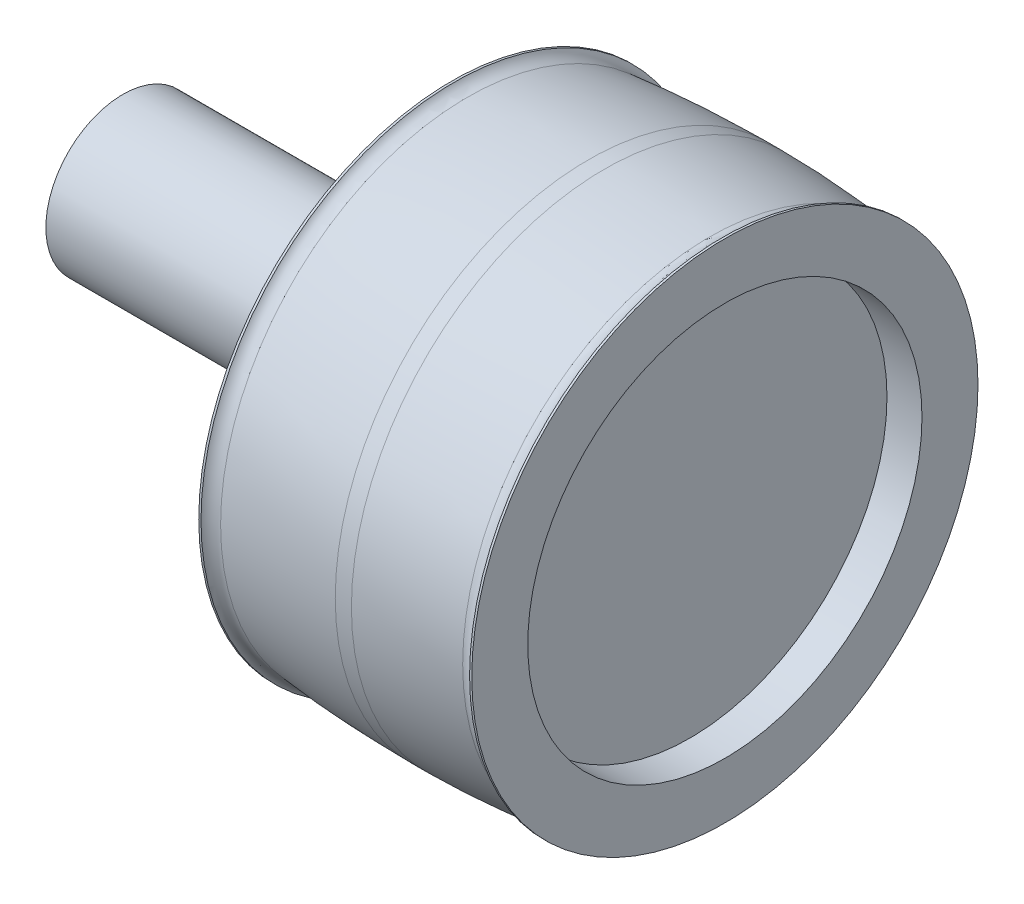
ISO-10303-21;
HEADER;
FILE_DESCRIPTION(('STEP AP214'),'2;1');
FILE_NAME('part.step','',(''),(''),'','','');
FILE_SCHEMA(('AUTOMOTIVE_DESIGN { 1 0 10303 214 1 1 1 1 }'));
ENDSEC;
DATA;
#1=APPLICATION_CONTEXT('core data for automotive mechanical design processes');
#2=APPLICATION_PROTOCOL_DEFINITION('international standard','automotive_design',2000,#1);
#3=PRODUCT_CONTEXT('',#1,'mechanical');
#4=PRODUCT('Part','Part','',(#3));
#5=PRODUCT_RELATED_PRODUCT_CATEGORY('part','',(#4));
#6=PRODUCT_DEFINITION_FORMATION('','',#4);
#7=PRODUCT_DEFINITION_CONTEXT('part definition',#1,'design');
#8=PRODUCT_DEFINITION('design','',#6,#7);
#9=PRODUCT_DEFINITION_SHAPE('','',#8);
#10=(LENGTH_UNIT() NAMED_UNIT(*) SI_UNIT(.MILLI.,.METRE.));
#11=(NAMED_UNIT(*) PLANE_ANGLE_UNIT() SI_UNIT($,.RADIAN.));
#12=(NAMED_UNIT(*) SI_UNIT($,.STERADIAN.) SOLID_ANGLE_UNIT());
#13=UNCERTAINTY_MEASURE_WITH_UNIT(LENGTH_MEASURE(1.E-05),#10,'distance_accuracy_value','');
#14=(GEOMETRIC_REPRESENTATION_CONTEXT(3) GLOBAL_UNCERTAINTY_ASSIGNED_CONTEXT((#13)) GLOBAL_UNIT_ASSIGNED_CONTEXT((#10,
#11,#12)) REPRESENTATION_CONTEXT('',''));
#15=CARTESIAN_POINT('',(0.,0.,0.));
#16=DIRECTION('',(0.,0.,1.));
#17=DIRECTION('',(1.,0.,0.));
#18=AXIS2_PLACEMENT_3D('',#15,#16,#17);
#19=CARTESIAN_POINT('',(-7.25,-30.6972760772363,-2.44967934269345E-11));
#20=DIRECTION('',(-1.,0.,0.));
#21=DIRECTION('',(0.,0.,1.));
#22=AXIS2_PLACEMENT_3D('',#19,#20,#21);
#23=PLANE('',#22);
#24=CARTESIAN_POINT('',(-7.25,-30.6972760772363,-2.44967934269345E-11));
#25=DIRECTION('',(-1.,0.,0.));
#26=DIRECTION('',(0.,0.,1.));
#27=AXIS2_PLACEMENT_3D('',#24,#25,#26);
#28=CIRCLE('',#27,14.08);
#29=CARTESIAN_POINT('',(-7.25,-30.6972760772363,14.0799999999755));
#30=VERTEX_POINT('',#29);
#31=EDGE_CURVE('E136',#30,#30,#28,.T.);
#32=ORIENTED_EDGE('',*,*,#31,.T.);
#33=EDGE_LOOP('',(#32));
#34=FACE_BOUND('',#33,.T.);
#35=CARTESIAN_POINT('',(-7.25,-30.6972760772363,-2.44967934269345E-11));
#36=DIRECTION('',(-1.,0.,0.));
#37=DIRECTION('',(0.,0.,1.));
#38=AXIS2_PLACEMENT_3D('',#35,#36,#37);
#39=CIRCLE('',#38,5.5);
#40=CARTESIAN_POINT('',(-7.25,-30.6972760772363,-5.5000000000245));
#41=VERTEX_POINT('',#40);
#42=EDGE_CURVE('E144',#41,#41,#39,.T.);
#43=ORIENTED_EDGE('',*,*,#42,.F.);
#44=EDGE_LOOP('',(#43));
#45=FACE_BOUND('',#44,.T.);
#46=ADVANCED_FACE('F31',(#34,#45),#23,.T.);
#47=CARTESIAN_POINT('',(-9.75,-30.6972760772363,-2.44967934269345E-11));
#48=DIRECTION('',(1.,0.,0.));
#49=DIRECTION('',(0.,0.,-1.));
#50=AXIS2_PLACEMENT_3D('',#47,#48,#49);
#51=CYLINDRICAL_SURFACE('',#50,18.08);
#52=CARTESIAN_POINT('',(-9.75,-30.6972760772363,-2.44967934269345E-11));
#53=DIRECTION('',(1.,0.,0.));
#54=DIRECTION('',(0.,0.,-1.));
#55=AXIS2_PLACEMENT_3D('',#52,#53,#54);
#56=CIRCLE('',#55,18.08);
#57=CARTESIAN_POINT('',(-9.75,-30.6972760772363,-18.0800000000245));
#58=VERTEX_POINT('',#57);
#59=EDGE_CURVE('E10',#58,#58,#56,.T.);
#60=ORIENTED_EDGE('',*,*,#59,.T.);
#61=EDGE_LOOP('',(#60));
#62=FACE_BOUND('',#61,.T.);
#63=CARTESIAN_POINT('',(-9.58956781339732,-30.6972760772363,-2.44967934269345E-11));
#64=DIRECTION('',(1.,0.,0.));
#65=DIRECTION('',(0.,0.,-1.));
#66=AXIS2_PLACEMENT_3D('',#63,#64,#65);
#67=CIRCLE('',#66,18.08);
#68=CARTESIAN_POINT('',(-9.58956781339732,-30.6972760772363,-18.0800000000245));
#69=VERTEX_POINT('',#68);
#70=EDGE_CURVE('E35',#69,#69,#67,.F.);
#71=ORIENTED_EDGE('',*,*,#70,.T.);
#72=EDGE_LOOP('',(#71));
#73=FACE_BOUND('',#72,.T.);
#74=ADVANCED_FACE('F33',(#62,#73),#51,.T.);
#75=CARTESIAN_POINT('',(-9.75,-30.6972760772363,-2.44967934269345E-11));
#76=DIRECTION('',(1.,0.,0.));
#77=DIRECTION('',(0.,0.,-1.));
#78=AXIS2_PLACEMENT_3D('',#75,#76,#77);
#79=PLANE('',#78);
#80=CARTESIAN_POINT('',(-9.75,-30.6972760772363,-2.44967934269345E-11));
#81=DIRECTION('',(-1.,0.,0.));
#82=DIRECTION('',(0.,0.,1.));
#83=AXIS2_PLACEMENT_3D('',#80,#81,#82);
#84=CIRCLE('',#83,14.08);
#85=CARTESIAN_POINT('',(-9.75,-30.6972760772363,14.0799999999755));
#86=VERTEX_POINT('',#85);
#87=EDGE_CURVE('E137',#86,#86,#84,.T.);
#88=ORIENTED_EDGE('',*,*,#87,.F.);
#89=EDGE_LOOP('',(#88));
#90=FACE_BOUND('',#89,.T.);
#91=ORIENTED_EDGE('',*,*,#59,.F.);
#92=EDGE_LOOP('',(#91));
#93=FACE_BOUND('',#92,.T.);
#94=ADVANCED_FACE('F96',(#90,#93),#79,.F.);
#95=CARTESIAN_POINT('',(-8.63949791795001,-13.0678970695124,0.));
#96=CARTESIAN_POINT('',(-5.9626586622051,-12.7702781079459,0.));
#97=CARTESIAN_POINT('',(1.01895096601607,-12.4807579289736,0.));
#98=CARTESIAN_POINT('',(5.40115706098064,-12.7298575540861,0.));
#99=CARTESIAN_POINT('',(8.64421147663579,-13.0748714856482,0.));
#100=B_SPLINE_CURVE_WITH_KNOTS('',3,(#95,#96,#97,#98,#99),.UNSPECIFIED.,.F.,.F.,(4,1,4),
(0.0573405456291309,0.473274059311417,0.946548118622834),.UNSPECIFIED.);
#101=CARTESIAN_POINT('',(9.75,-30.6972760772363,-2.44967934269345E-11));
#102=DIRECTION('',(-1.,0.,0.));
#103=AXIS1_PLACEMENT('',#101,#102);
#104=SURFACE_OF_REVOLUTION('',#100,#103);
#105=CARTESIAN_POINT('',(-1.64798730217797E-13,-30.6972760772363,-2.44967934269345E-11));
#106=DIRECTION('',(-1.,0.,0.));
#107=DIRECTION('',(0.,0.,1.));
#108=AXIS2_PLACEMENT_3D('',#105,#106,#107);
#109=CIRCLE('',#108,18.08);
#110=CARTESIAN_POINT('',(-1.64798730217797E-13,-30.6972760772363,18.0799999999755));
#111=VERTEX_POINT('',#110);
#112=EDGE_CURVE('E53',#111,#111,#109,.F.);
#113=ORIENTED_EDGE('',*,*,#112,.F.);
#114=EDGE_LOOP('',(#113));
#115=FACE_BOUND('',#114,.T.);
#116=CARTESIAN_POINT('',(-8.63949791795001,-30.6972760772363,-2.44967934269345E-11));
#117=DIRECTION('',(-1.,0.,0.));
#118=DIRECTION('',(0.,0.,1.));
#119=AXIS2_PLACEMENT_3D('',#116,#117,#118);
#120=CIRCLE('',#119,17.6293790077238);
#121=CARTESIAN_POINT('',(-8.63949791795001,-30.6972760772363,17.6293790076993));
#122=VERTEX_POINT('',#121);
#123=EDGE_CURVE('E51',#122,#122,#120,.T.);
#124=ORIENTED_EDGE('',*,*,#123,.F.);
#125=EDGE_LOOP('',(#124));
#126=FACE_BOUND('',#125,.T.);
#127=ADVANCED_FACE('F65',(#115,#126),#104,.F.);
#128=CARTESIAN_POINT('',(-8.7500000000016,-30.6972760772363,-2.44967934269345E-11));
#129=DIRECTION('',(-1.,0.,0.));
#130=DIRECTION('',(0.,0.,1.));
#131=AXIS2_PLACEMENT_3D('',#128,#129,#130);
#132=TOROIDAL_SURFACE('',#131,18.6232549003092,0.999999999999997);
#133=ORIENTED_EDGE('',*,*,#70,.F.);
#134=EDGE_LOOP('',(#133));
#135=FACE_BOUND('',#134,.T.);
#136=ORIENTED_EDGE('',*,*,#123,.T.);
#137=EDGE_LOOP('',(#136));
#138=FACE_BOUND('',#137,.T.);
#139=ADVANCED_FACE('F61',(#135,#138),#132,.F.);
#140=CARTESIAN_POINT('',(1.15355220921084,-30.6972760772363,-2.44967934269345E-11));
#141=DIRECTION('',(-1.,0.,0.));
#142=DIRECTION('',(0.,0.,1.));
#143=AXIS2_PLACEMENT_3D('',#140,#141,#142);
#144=CIRCLE('',#143,18.08);
#145=CARTESIAN_POINT('',(1.15355220921084,-30.6972760772363,18.0799999999755));
#146=VERTEX_POINT('',#145);
#147=EDGE_CURVE('E50',#146,#146,#144,.T.);
#148=ORIENTED_EDGE('',*,*,#147,.T.);
#149=EDGE_LOOP('',(#148));
#150=FACE_BOUND('',#149,.T.);
#151=ORIENTED_EDGE('',*,*,#112,.T.);
#152=EDGE_LOOP('',(#151));
#153=FACE_BOUND('',#152,.T.);
#154=ADVANCED_FACE('F64',(#150,#153),#51,.T.);
#155=CARTESIAN_POINT('',(8.74999999999871,-30.6972760772363,-2.44967934269345E-11));
#156=DIRECTION('',(-1.,0.,0.));
#157=DIRECTION('',(0.,0.,1.));
#158=AXIS2_PLACEMENT_3D('',#155,#156,#157);
#159=TOROIDAL_SURFACE('',#158,18.6167932421291,1.);
#160=CARTESIAN_POINT('',(9.59371382304805,-30.6972760772363,-2.44967934269345E-11));
#161=DIRECTION('',(-1.,0.,0.));
#162=DIRECTION('',(0.,0.,1.));
#163=AXIS2_PLACEMENT_3D('',#160,#161,#162);
#164=CIRCLE('',#163,18.08);
#165=CARTESIAN_POINT('',(9.59371382304805,-30.6972760772363,18.0799999999755));
#166=VERTEX_POINT('',#165);
#167=EDGE_CURVE('E47',#166,#166,#164,.F.);
#168=ORIENTED_EDGE('',*,*,#167,.F.);
#169=EDGE_LOOP('',(#168));
#170=FACE_BOUND('',#169,.T.);
#171=CARTESIAN_POINT('',(8.64421147663579,-30.6972760772363,-2.44967934269345E-11));
#172=DIRECTION('',(-1.,0.,0.));
#173=DIRECTION('',(0.,0.,1.));
#174=AXIS2_PLACEMENT_3D('',#171,#172,#173);
#175=CIRCLE('',#174,17.6224045915881);
#176=CARTESIAN_POINT('',(8.64421147663579,-30.6972760772363,17.6224045915636));
#177=VERTEX_POINT('',#176);
#178=EDGE_CURVE('E70',#177,#177,#175,.T.);
#179=ORIENTED_EDGE('',*,*,#178,.F.);
#180=EDGE_LOOP('',(#179));
#181=FACE_BOUND('',#180,.T.);
#182=ADVANCED_FACE('F89',(#170,#181),#159,.F.);
#183=ORIENTED_EDGE('',*,*,#147,.F.);
#184=EDGE_LOOP('',(#183));
#185=FACE_BOUND('',#184,.T.);
#186=ORIENTED_EDGE('',*,*,#178,.T.);
#187=EDGE_LOOP('',(#186));
#188=FACE_BOUND('',#187,.T.);
#189=ADVANCED_FACE('F85',(#185,#188),#104,.F.);
#190=CARTESIAN_POINT('',(9.75,-30.6972760772363,-2.44967934269345E-11));
#191=DIRECTION('',(1.,0.,0.));
#192=DIRECTION('',(0.,0.,-1.));
#193=AXIS2_PLACEMENT_3D('',#190,#191,#192);
#194=PLANE('',#193);
#195=CARTESIAN_POINT('',(9.75,-30.6972760772363,-2.44967934269345E-11));
#196=DIRECTION('',(1.,0.,0.));
#197=DIRECTION('',(0.,0.,-1.));
#198=AXIS2_PLACEMENT_3D('',#195,#196,#197);
#199=CIRCLE('',#198,14.08);
#200=CARTESIAN_POINT('',(9.75,-30.6972760772363,-14.0800000000245));
#201=VERTEX_POINT('',#200);
#202=EDGE_CURVE('E79',#201,#201,#199,.T.);
#203=ORIENTED_EDGE('',*,*,#202,.F.);
#204=EDGE_LOOP('',(#203));
#205=FACE_BOUND('',#204,.T.);
#206=CARTESIAN_POINT('',(9.75,-30.6972760772363,-2.44967934269345E-11));
#207=DIRECTION('',(1.,0.,0.));
#208=DIRECTION('',(0.,0.,-1.));
#209=AXIS2_PLACEMENT_3D('',#206,#207,#208);
#210=CIRCLE('',#209,18.08);
#211=CARTESIAN_POINT('',(9.75,-30.6972760772363,-18.0800000000245));
#212=VERTEX_POINT('',#211);
#213=EDGE_CURVE('E39',#212,#212,#210,.T.);
#214=ORIENTED_EDGE('',*,*,#213,.T.);
#215=EDGE_LOOP('',(#214));
#216=FACE_BOUND('',#215,.T.);
#217=ADVANCED_FACE('F88',(#205,#216),#194,.T.);
#218=ORIENTED_EDGE('',*,*,#213,.F.);
#219=EDGE_LOOP('',(#218));
#220=FACE_BOUND('',#219,.T.);
#221=ORIENTED_EDGE('',*,*,#167,.T.);
#222=EDGE_LOOP('',(#221));
#223=FACE_BOUND('',#222,.T.);
#224=ADVANCED_FACE('F94',(#220,#223),#51,.T.);
#225=CARTESIAN_POINT('',(7.25,-30.6972760772363,-2.44967934269345E-11));
#226=DIRECTION('',(1.,0.,0.));
#227=DIRECTION('',(0.,0.,-1.));
#228=AXIS2_PLACEMENT_3D('',#225,#226,#227);
#229=CYLINDRICAL_SURFACE('',#228,14.08);
#230=CARTESIAN_POINT('',(7.25,-30.6972760772363,-2.44967934269345E-11));
#231=DIRECTION('',(1.,0.,0.));
#232=DIRECTION('',(0.,0.,-1.));
#233=AXIS2_PLACEMENT_3D('',#230,#231,#232);
#234=CIRCLE('',#233,14.08);
#235=CARTESIAN_POINT('',(7.25,-30.6972760772363,-14.0800000000245));
#236=VERTEX_POINT('',#235);
#237=EDGE_CURVE('E72',#236,#236,#234,.T.);
#238=ORIENTED_EDGE('',*,*,#237,.F.);
#239=EDGE_LOOP('',(#238));
#240=FACE_BOUND('',#239,.T.);
#241=ORIENTED_EDGE('',*,*,#202,.T.);
#242=EDGE_LOOP('',(#241));
#243=FACE_BOUND('',#242,.T.);
#244=ADVANCED_FACE('F123',(#240,#243),#229,.F.);
#245=CARTESIAN_POINT('',(7.25,-30.6972760772363,-2.44967934269345E-11));
#246=DIRECTION('',(1.,0.,0.));
#247=DIRECTION('',(0.,0.,-1.));
#248=AXIS2_PLACEMENT_3D('',#245,#246,#247);
#249=PLANE('',#248);
#250=ORIENTED_EDGE('',*,*,#237,.T.);
#251=EDGE_LOOP('',(#250));
#252=FACE_BOUND('',#251,.T.);
#253=ADVANCED_FACE('F120',(#252),#249,.T.);
#254=CARTESIAN_POINT('',(-7.25,-30.6972760772363,-2.44967934269345E-11));
#255=DIRECTION('',(-1.,0.,0.));
#256=DIRECTION('',(0.,0.,1.));
#257=AXIS2_PLACEMENT_3D('',#254,#255,#256);
#258=CYLINDRICAL_SURFACE('',#257,14.08);
#259=ORIENTED_EDGE('',*,*,#31,.F.);
#260=EDGE_LOOP('',(#259));
#261=FACE_BOUND('',#260,.T.);
#262=ORIENTED_EDGE('',*,*,#87,.T.);
#263=EDGE_LOOP('',(#262));
#264=FACE_BOUND('',#263,.T.);
#265=ADVANCED_FACE('F117',(#261,#264),#258,.F.);
#266=CARTESIAN_POINT('',(-33.25,-30.6972760772363,-2.44967934269345E-11));
#267=DIRECTION('',(1.,0.,0.));
#268=DIRECTION('',(0.,0.,-1.));
#269=AXIS2_PLACEMENT_3D('',#266,#267,#268);
#270=CYLINDRICAL_SURFACE('',#269,5.5);
#271=CARTESIAN_POINT('',(-33.25,-30.6972760772363,-2.44967934269345E-11));
#272=DIRECTION('',(-1.,0.,0.));
#273=DIRECTION('',(0.,0.,1.));
#274=AXIS2_PLACEMENT_3D('',#271,#272,#273);
#275=CIRCLE('',#274,5.5);
#276=CARTESIAN_POINT('',(-33.25,-30.6972760772363,-5.5000000000245));
#277=VERTEX_POINT('',#276);
#278=EDGE_CURVE('E141',#277,#277,#275,.T.);
#279=CARTESIAN_POINT('',(-33.25,-30.6972760772363,-5.5000000000245));
#280=CARTESIAN_POINT('',(-32.9791666666667,-30.6972760772363,-5.5000000000245));
#281=CARTESIAN_POINT('',(-32.7083333333333,-30.6972760772363,-5.5000000000245));
#282=CARTESIAN_POINT('',(-32.1666666666667,-30.6972760772363,-5.5000000000245));
#283=CARTESIAN_POINT('',(-31.8958333333333,-30.6972760772363,-5.5000000000245));
#284=CARTESIAN_POINT('',(-31.3541666666667,-30.6972760772363,-5.5000000000245));
#285=CARTESIAN_POINT('',(-31.0833333333333,-30.6972760772363,-5.5000000000245));
#286=CARTESIAN_POINT('',(-30.5416666666667,-30.6972760772363,-5.5000000000245));
#287=CARTESIAN_POINT('',(-30.2708333333333,-30.6972760772363,-5.5000000000245));
#288=CARTESIAN_POINT('',(-29.7291666666667,-30.6972760772363,-5.5000000000245));
#289=CARTESIAN_POINT('',(-29.4583333333333,-30.6972760772363,-5.5000000000245));
#290=CARTESIAN_POINT('',(-28.9166666666667,-30.6972760772363,-5.5000000000245));
#291=CARTESIAN_POINT('',(-28.6458333333333,-30.6972760772363,-5.5000000000245));
#292=CARTESIAN_POINT('',(-28.1041666666667,-30.6972760772363,-5.5000000000245));
#293=CARTESIAN_POINT('',(-27.8333333333333,-30.6972760772363,-5.5000000000245));
#294=CARTESIAN_POINT('',(-27.2916666666667,-30.6972760772363,-5.5000000000245));
#295=CARTESIAN_POINT('',(-27.0208333333333,-30.6972760772363,-5.5000000000245));
#296=CARTESIAN_POINT('',(-26.4791666666667,-30.6972760772363,-5.5000000000245));
#297=CARTESIAN_POINT('',(-26.2083333333333,-30.6972760772363,-5.5000000000245));
#298=CARTESIAN_POINT('',(-25.6666666666667,-30.6972760772363,-5.5000000000245));
#299=CARTESIAN_POINT('',(-25.3958333333333,-30.6972760772363,-5.5000000000245));
#300=CARTESIAN_POINT('',(-24.8541666666667,-30.6972760772363,-5.5000000000245));
#301=CARTESIAN_POINT('',(-24.5833333333333,-30.6972760772363,-5.5000000000245));
#302=CARTESIAN_POINT('',(-24.0416666666667,-30.6972760772363,-5.5000000000245));
#303=CARTESIAN_POINT('',(-23.7708333333333,-30.6972760772363,-5.5000000000245));
#304=CARTESIAN_POINT('',(-23.2291666666667,-30.6972760772363,-5.5000000000245));
#305=CARTESIAN_POINT('',(-22.9583333333333,-30.6972760772363,-5.5000000000245));
#306=CARTESIAN_POINT('',(-22.4166666666667,-30.6972760772363,-5.5000000000245));
#307=CARTESIAN_POINT('',(-22.1458333333333,-30.6972760772363,-5.5000000000245));
#308=CARTESIAN_POINT('',(-21.6041666666667,-30.6972760772363,-5.5000000000245));
#309=CARTESIAN_POINT('',(-21.3333333333333,-30.6972760772363,-5.5000000000245));
#310=CARTESIAN_POINT('',(-20.7916666666667,-30.6972760772363,-5.5000000000245));
#311=CARTESIAN_POINT('',(-20.5208333333333,-30.6972760772363,-5.5000000000245));
#312=CARTESIAN_POINT('',(-19.9791666666667,-30.6972760772363,-5.5000000000245));
#313=CARTESIAN_POINT('',(-19.7083333333333,-30.6972760772363,-5.5000000000245));
#314=CARTESIAN_POINT('',(-19.1666666666667,-30.6972760772363,-5.5000000000245));
#315=CARTESIAN_POINT('',(-18.8958333333333,-30.6972760772363,-5.5000000000245));
#316=CARTESIAN_POINT('',(-18.3541666666667,-30.6972760772363,-5.5000000000245));
#317=CARTESIAN_POINT('',(-18.0833333333333,-30.6972760772363,-5.5000000000245));
#318=CARTESIAN_POINT('',(-17.5416666666667,-30.6972760772363,-5.5000000000245));
#319=CARTESIAN_POINT('',(-17.2708333333333,-30.6972760772363,-5.5000000000245));
#320=CARTESIAN_POINT('',(-16.7291666666667,-30.6972760772363,-5.5000000000245));
#321=CARTESIAN_POINT('',(-16.4583333333333,-30.6972760772363,-5.5000000000245));
#322=CARTESIAN_POINT('',(-15.9166666666667,-30.6972760772363,-5.5000000000245));
#323=CARTESIAN_POINT('',(-15.6458333333333,-30.6972760772363,-5.5000000000245));
#324=CARTESIAN_POINT('',(-15.1041666666667,-30.6972760772363,-5.5000000000245));
#325=CARTESIAN_POINT('',(-14.8333333333333,-30.6972760772363,-5.5000000000245));
#326=CARTESIAN_POINT('',(-14.2916666666667,-30.6972760772363,-5.5000000000245));
#327=CARTESIAN_POINT('',(-14.0208333333333,-30.6972760772363,-5.5000000000245));
#328=CARTESIAN_POINT('',(-13.4791666666667,-30.6972760772363,-5.5000000000245));
#329=CARTESIAN_POINT('',(-13.2083333333333,-30.6972760772363,-5.5000000000245));
#330=CARTESIAN_POINT('',(-12.6666666666667,-30.6972760772363,-5.5000000000245));
#331=CARTESIAN_POINT('',(-12.3958333333333,-30.6972760772363,-5.5000000000245));
#332=CARTESIAN_POINT('',(-11.8541666666667,-30.6972760772363,-5.5000000000245));
#333=CARTESIAN_POINT('',(-11.5833333333333,-30.6972760772363,-5.5000000000245));
#334=CARTESIAN_POINT('',(-11.0416666666667,-30.6972760772363,-5.5000000000245));
#335=CARTESIAN_POINT('',(-10.7708333333333,-30.6972760772363,-5.5000000000245));
#336=CARTESIAN_POINT('',(-10.2291666666667,-30.6972760772363,-5.5000000000245));
#337=CARTESIAN_POINT('',(-9.95833333333333,-30.6972760772363,-5.5000000000245));
#338=CARTESIAN_POINT('',(-9.41666666666667,-30.6972760772363,-5.5000000000245));
#339=CARTESIAN_POINT('',(-9.14583333333333,-30.6972760772363,-5.5000000000245));
#340=CARTESIAN_POINT('',(-8.60416666666666,-30.6972760772363,-5.5000000000245));
#341=CARTESIAN_POINT('',(-8.33333333333333,-30.6972760772363,-5.5000000000245));
#342=CARTESIAN_POINT('',(-7.79166666666666,-30.6972760772363,-5.5000000000245));
#343=CARTESIAN_POINT('',(-7.52083333333333,-30.6972760772363,-5.5000000000245));
#344=CARTESIAN_POINT('',(-7.25,-30.6972760772363,-5.5000000000245));
#345=B_SPLINE_CURVE_WITH_KNOTS('',3,(#279,#280,#281,#282,#283,#284,#285,#286,#287,#288,#289,
#290,#291,#292,#293,#294,#295,#296,#297,#298,#299,#300,#301,#302,#303,#304,#305,#306,#307,#308,
#309,#310,#311,#312,#313,#314,#315,#316,#317,#318,#319,#320,#321,#322,#323,#324,#325,#326,#327,
#328,#329,#330,#331,#332,#333,#334,#335,#336,#337,#338,#339,#340,#341,#342,#343,#344),
.UNSPECIFIED.,.F.,.F.,(4,2,2,2,2,2,2,2,2,2,2,2,2,2,2,2,2,2,2,2,2,2,2,2,2,2,2,2,2,2,2,2,4),(0.,
0.812500000000001,1.625,2.4375,3.25,4.0625,4.875,5.68750000000001,6.50000000000001,7.3125,8.125,
8.93750000000001,9.75,10.5625,11.375,12.1875,13.,13.8125,14.625,15.4375,16.25,17.0625,17.875,
18.6875,19.5,20.3125,21.125,21.9375,22.75,23.5625,24.375,25.1875,26.),.UNSPECIFIED.);
#346=EDGE_CURVE('BSEAM115',#277,#41,#345,.T.);
#347=ORIENTED_EDGE('',*,*,#278,.F.);
#348=ORIENTED_EDGE('',*,*,#42,.T.);
#349=ORIENTED_EDGE('',*,*,#346,.T.);
#350=ORIENTED_EDGE('',*,*,#346,.F.);
#351=EDGE_LOOP('',(#347,#349,#348,#350));
#352=FACE_BOUND('',#351,.T.);
#353=ADVANCED_FACE('F115',(#352),#270,.T.);
#354=CARTESIAN_POINT('',(-33.25,-30.6972760772363,-2.44967934269345E-11));
#355=DIRECTION('',(-1.,0.,0.));
#356=DIRECTION('',(0.,0.,1.));
#357=AXIS2_PLACEMENT_3D('',#354,#355,#356);
#358=PLANE('',#357);
#359=ORIENTED_EDGE('',*,*,#278,.T.);
#360=EDGE_LOOP('',(#359));
#361=FACE_BOUND('',#360,.T.);
#362=ADVANCED_FACE('F150',(#361),#358,.T.);
#363=CLOSED_SHELL('',(#46,#74,#94,#127,#139,#154,#182,#189,#217,#224,#244,#253,#265,#353,#362));
#364=MANIFOLD_SOLID_BREP('B2',#363);
#365=ADVANCED_BREP_SHAPE_REPRESENTATION('',(#18,#364),#14);
#366=SHAPE_DEFINITION_REPRESENTATION(#9,#365);
ENDSEC;
END-ISO-10303-21;
